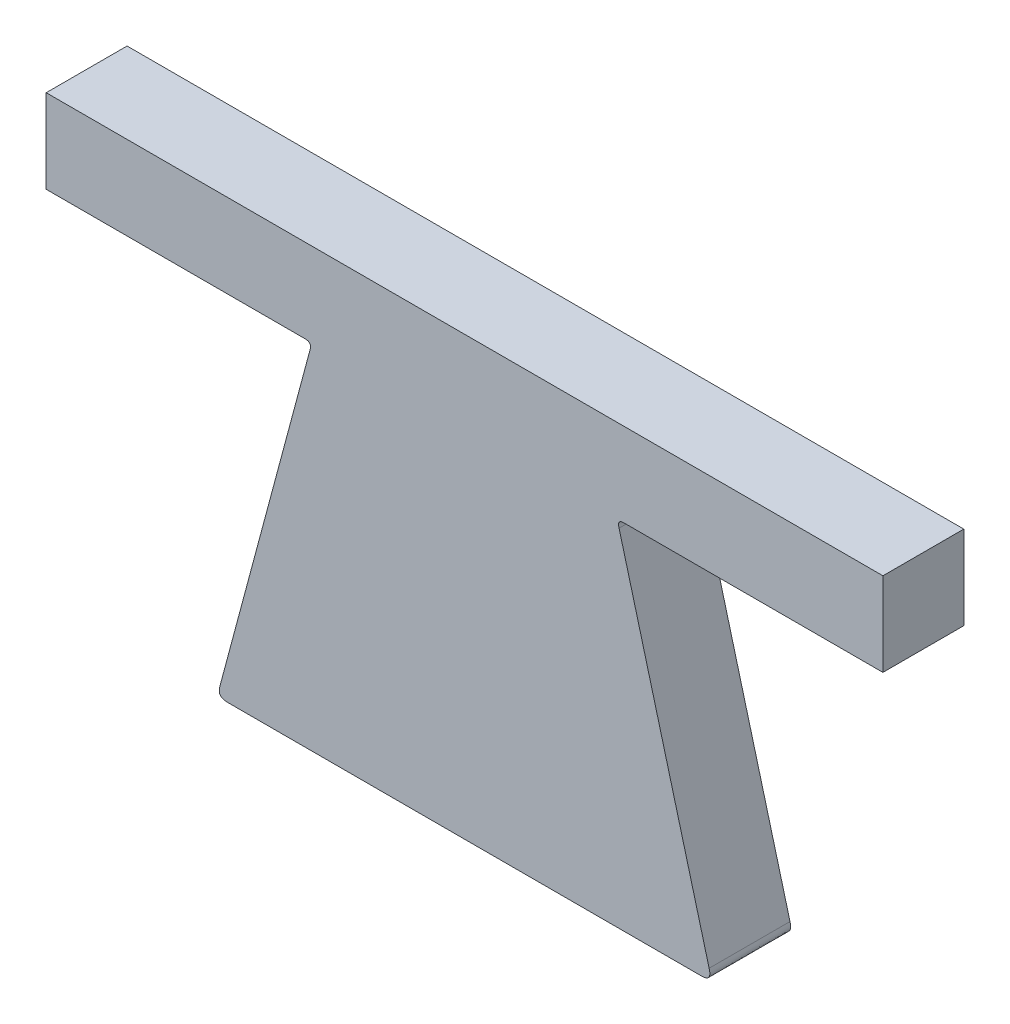
ISO-10303-21;
HEADER;
FILE_DESCRIPTION(('STEP AP214'),'2;1');
FILE_NAME('part.step','',(''),(''),'','','');
FILE_SCHEMA(('AUTOMOTIVE_DESIGN { 1 0 10303 214 1 1 1 1 }'));
ENDSEC;
DATA;
#1=APPLICATION_CONTEXT('core data for automotive mechanical design processes');
#2=APPLICATION_PROTOCOL_DEFINITION('international standard','automotive_design',2000,#1);
#3=PRODUCT_CONTEXT('',#1,'mechanical');
#4=PRODUCT('Part','Part','',(#3));
#5=PRODUCT_RELATED_PRODUCT_CATEGORY('part','',(#4));
#6=PRODUCT_DEFINITION_FORMATION('','',#4);
#7=PRODUCT_DEFINITION_CONTEXT('part definition',#1,'design');
#8=PRODUCT_DEFINITION('design','',#6,#7);
#9=PRODUCT_DEFINITION_SHAPE('','',#8);
#10=(LENGTH_UNIT() NAMED_UNIT(*) SI_UNIT(.MILLI.,.METRE.));
#11=(NAMED_UNIT(*) PLANE_ANGLE_UNIT() SI_UNIT($,.RADIAN.));
#12=(NAMED_UNIT(*) SI_UNIT($,.STERADIAN.) SOLID_ANGLE_UNIT());
#13=UNCERTAINTY_MEASURE_WITH_UNIT(LENGTH_MEASURE(1.E-05),#10,'distance_accuracy_value','');
#14=(GEOMETRIC_REPRESENTATION_CONTEXT(3) GLOBAL_UNCERTAINTY_ASSIGNED_CONTEXT((#13)) GLOBAL_UNIT_ASSIGNED_CONTEXT((#10,
#11,#12)) REPRESENTATION_CONTEXT('',''));
#15=CARTESIAN_POINT('',(0.,0.,0.));
#16=DIRECTION('',(0.,0.,1.));
#17=DIRECTION('',(1.,0.,0.));
#18=AXIS2_PLACEMENT_3D('',#15,#16,#17);
#19=CARTESIAN_POINT('',(-3.,15.78,-36.8505893597143));
#20=DIRECTION('',(0.,-1.,0.));
#21=DIRECTION('',(0.,0.,-1.));
#22=AXIS2_PLACEMENT_3D('',#19,#20,#21);
#23=PLANE('',#22);
#24=DIRECTION('',(-1.,0.,0.));
#25=VECTOR('',#24,1.);
#26=CARTESIAN_POINT('',(-3.,15.78,-2.9));
#27=LINE('',#26,#25);
#28=CARTESIAN_POINT('',(6.26727322274248,15.78,-2.9));
#29=VERTEX_POINT('',#28);
#30=CARTESIAN_POINT('',(-3.,15.78,-2.9));
#31=VERTEX_POINT('',#30);
#32=EDGE_CURVE('E182',#29,#31,#27,.T.);
#33=ORIENTED_EDGE('',*,*,#32,.F.);
#34=CARTESIAN_POINT('',(6.26727322274248,15.78,0.144999999999999));
#35=CARTESIAN_POINT('',(6.26727322274248,15.78,-0.918333333333333));
#36=CARTESIAN_POINT('',(6.26727322274248,15.78,-1.98166666666669));
#37=CARTESIAN_POINT('',(6.26727322274248,15.78,-3.04500000000002));
#38=B_SPLINE_CURVE_WITH_KNOTS('',3,(#34,#35,#36,#37),.UNSPECIFIED.,.F.,.F.,(4,4),
(-0.0369955893597143,-0.0338055893597143),.UNSPECIFIED.);
#39=CARTESIAN_POINT('',(6.26727322274248,15.78,0.));
#40=VERTEX_POINT('',#39);
#41=EDGE_CURVE('E416',#29,#40,#38,.F.);
#42=ORIENTED_EDGE('',*,*,#41,.T.);
#43=DIRECTION('',(1.,0.,0.));
#44=VECTOR('',#43,1.);
#45=CARTESIAN_POINT('',(-3.,15.78,0.));
#46=LINE('',#45,#44);
#47=CARTESIAN_POINT('',(-3.,15.78,0.));
#48=VERTEX_POINT('',#47);
#49=EDGE_CURVE('E393',#48,#40,#46,.T.);
#50=ORIENTED_EDGE('',*,*,#49,.F.);
#51=DIRECTION('',(0.,0.,1.));
#52=VECTOR('',#51,1.);
#53=CARTESIAN_POINT('',(-3.,15.78,-36.8505893597143));
#54=LINE('',#53,#52);
#55=EDGE_CURVE('E170',#31,#48,#54,.T.);
#56=ORIENTED_EDGE('',*,*,#55,.F.);
#57=EDGE_LOOP('',(#33,#42,#50,#56));
#58=FACE_BOUND('',#57,.T.);
#59=ADVANCED_FACE('F46',(#58),#23,.T.);
#60=CARTESIAN_POINT('',(-3.,18.78,-36.8505893597143));
#61=DIRECTION('',(-1.,0.,0.));
#62=DIRECTION('',(0.,0.,1.));
#63=AXIS2_PLACEMENT_3D('',#60,#61,#62);
#64=PLANE('',#63);
#65=DIRECTION('',(0.,1.,0.));
#66=VECTOR('',#65,1.);
#67=CARTESIAN_POINT('',(-3.,18.78,-2.9));
#68=LINE('',#67,#66);
#69=CARTESIAN_POINT('',(-3.,18.78,-2.9));
#70=VERTEX_POINT('',#69);
#71=EDGE_CURVE('E392',#31,#70,#68,.T.);
#72=ORIENTED_EDGE('',*,*,#71,.F.);
#73=ORIENTED_EDGE('',*,*,#55,.T.);
#74=DIRECTION('',(0.,-1.,0.));
#75=VECTOR('',#74,1.);
#76=CARTESIAN_POINT('',(-3.,18.78,0.));
#77=LINE('',#76,#75);
#78=CARTESIAN_POINT('',(-3.,18.78,0.));
#79=VERTEX_POINT('',#78);
#80=EDGE_CURVE('E156',#79,#48,#77,.T.);
#81=ORIENTED_EDGE('',*,*,#80,.F.);
#82=DIRECTION('',(0.,0.,1.));
#83=VECTOR('',#82,1.);
#84=CARTESIAN_POINT('',(-3.,18.78,-36.8505893597143));
#85=LINE('',#84,#83);
#86=EDGE_CURVE('E173',#70,#79,#85,.T.);
#87=ORIENTED_EDGE('',*,*,#86,.F.);
#88=EDGE_LOOP('',(#72,#73,#81,#87));
#89=FACE_BOUND('',#88,.T.);
#90=ADVANCED_FACE('F427',(#89),#64,.T.);
#91=CARTESIAN_POINT('',(-3.,18.78,-36.8505893597143));
#92=DIRECTION('',(0.,1.,0.));
#93=DIRECTION('',(0.,0.,1.));
#94=AXIS2_PLACEMENT_3D('',#91,#92,#93);
#95=PLANE('',#94);
#96=DIRECTION('',(1.,0.,0.));
#97=VECTOR('',#96,1.);
#98=CARTESIAN_POINT('',(-3.,18.78,-2.9));
#99=LINE('',#98,#97);
#100=CARTESIAN_POINT('',(27.,18.78,-2.9));
#101=VERTEX_POINT('',#100);
#102=EDGE_CURVE('E430',#70,#101,#99,.T.);
#103=ORIENTED_EDGE('',*,*,#102,.F.);
#104=ORIENTED_EDGE('',*,*,#86,.T.);
#105=DIRECTION('',(-1.,0.,0.));
#106=VECTOR('',#105,1.);
#107=CARTESIAN_POINT('',(-3.,18.78,0.));
#108=LINE('',#107,#106);
#109=CARTESIAN_POINT('',(27.,18.78,0.));
#110=VERTEX_POINT('',#109);
#111=EDGE_CURVE('E161',#110,#79,#108,.T.);
#112=ORIENTED_EDGE('',*,*,#111,.F.);
#113=DIRECTION('',(0.,0.,1.));
#114=VECTOR('',#113,1.);
#115=CARTESIAN_POINT('',(27.,18.78,-36.8505893597143));
#116=LINE('',#115,#114);
#117=EDGE_CURVE('E155',#101,#110,#116,.T.);
#118=ORIENTED_EDGE('',*,*,#117,.F.);
#119=EDGE_LOOP('',(#103,#104,#112,#118));
#120=FACE_BOUND('',#119,.T.);
#121=ADVANCED_FACE('F434',(#120),#95,.T.);
#122=CARTESIAN_POINT('',(27.,18.78,-36.8505893597143));
#123=DIRECTION('',(1.,0.,0.));
#124=DIRECTION('',(0.,0.,-1.));
#125=AXIS2_PLACEMENT_3D('',#122,#123,#124);
#126=PLANE('',#125);
#127=DIRECTION('',(0.,-1.,0.));
#128=VECTOR('',#127,1.);
#129=CARTESIAN_POINT('',(27.,18.78,-2.9));
#130=LINE('',#129,#128);
#131=CARTESIAN_POINT('',(27.,15.78,-2.9));
#132=VERTEX_POINT('',#131);
#133=EDGE_CURVE('E233',#101,#132,#130,.T.);
#134=ORIENTED_EDGE('',*,*,#133,.F.);
#135=ORIENTED_EDGE('',*,*,#117,.T.);
#136=DIRECTION('',(0.,1.,0.));
#137=VECTOR('',#136,1.);
#138=CARTESIAN_POINT('',(27.,18.78,0.));
#139=LINE('',#138,#137);
#140=CARTESIAN_POINT('',(27.,15.78,0.));
#141=VERTEX_POINT('',#140);
#142=EDGE_CURVE('E146',#141,#110,#139,.T.);
#143=ORIENTED_EDGE('',*,*,#142,.F.);
#144=DIRECTION('',(0.,0.,1.));
#145=VECTOR('',#144,1.);
#146=CARTESIAN_POINT('',(27.,15.78,-36.8505893597143));
#147=LINE('',#146,#145);
#148=EDGE_CURVE('E150',#132,#141,#147,.T.);
#149=ORIENTED_EDGE('',*,*,#148,.F.);
#150=EDGE_LOOP('',(#134,#135,#143,#149));
#151=FACE_BOUND('',#150,.T.);
#152=ADVANCED_FACE('F158',(#151),#126,.T.);
#153=CARTESIAN_POINT('',(17.4720817026893,15.78,-36.8505893597143));
#154=DIRECTION('',(0.,-1.,0.));
#155=DIRECTION('',(0.,0.,-1.));
#156=AXIS2_PLACEMENT_3D('',#153,#154,#155);
#157=PLANE('',#156);
#158=DIRECTION('',(1.,0.,0.));
#159=VECTOR('',#158,1.);
#160=CARTESIAN_POINT('',(17.4720817026893,15.78,0.));
#161=LINE('',#160,#159);
#162=CARTESIAN_POINT('',(17.7327267772575,15.78,0.));
#163=VERTEX_POINT('',#162);
#164=EDGE_CURVE('E140',#163,#141,#161,.T.);
#165=ORIENTED_EDGE('',*,*,#164,.F.);
#166=CARTESIAN_POINT('',(17.7327267772575,15.78,-3.04500000000002));
#167=CARTESIAN_POINT('',(17.7327267772575,15.78,-1.98166666666669));
#168=CARTESIAN_POINT('',(17.7327267772575,15.78,-0.918333333333333));
#169=CARTESIAN_POINT('',(17.7327267772575,15.78,0.144999999999999));
#170=B_SPLINE_CURVE_WITH_KNOTS('',3,(#166,#167,#168,#169),.UNSPECIFIED.,.F.,.F.,(4,4),
(-0.0369955893597143,-0.0338055893597143),.UNSPECIFIED.);
#171=CARTESIAN_POINT('',(17.7327267772575,15.78,-2.9));
#172=VERTEX_POINT('',#171);
#173=EDGE_CURVE('E74',#163,#172,#170,.F.);
#174=ORIENTED_EDGE('',*,*,#173,.T.);
#175=DIRECTION('',(-1.,0.,0.));
#176=VECTOR('',#175,1.);
#177=CARTESIAN_POINT('',(17.4720817026893,15.78,-2.9));
#178=LINE('',#177,#176);
#179=EDGE_CURVE('E152',#132,#172,#178,.T.);
#180=ORIENTED_EDGE('',*,*,#179,.F.);
#181=ORIENTED_EDGE('',*,*,#148,.T.);
#182=EDGE_LOOP('',(#165,#174,#180,#181));
#183=FACE_BOUND('',#182,.T.);
#184=ADVANCED_FACE('F151',(#183),#157,.T.);
#185=CARTESIAN_POINT('',(20.8696774627159,3.1,-36.8505893597143));
#186=DIRECTION('',(0.965925826289069,0.258819045102518,0.));
#187=DIRECTION('',(-0.258819045102518,0.965925826289069,0.));
#188=AXIS2_PLACEMENT_3D('',#185,#186,#187);
#189=PLANE('',#188);
#190=DIRECTION('',(0.258819045102518,-0.965925826289069,0.));
#191=VECTOR('',#190,1.);
#192=CARTESIAN_POINT('',(20.8696774627159,3.1,-2.9));
#193=LINE('',#192,#191);
#194=CARTESIAN_POINT('',(17.5395416119997,15.5282361909795,-2.9));
#195=VERTEX_POINT('',#194);
#196=CARTESIAN_POINT('',(20.7684875987502,3.47764571353075,-2.9));
#197=VERTEX_POINT('',#196);
#198=EDGE_CURVE('E217',#195,#197,#193,.T.);
#199=ORIENTED_EDGE('',*,*,#198,.F.);
#200=CARTESIAN_POINT('',(17.5395416119997,15.5282361909795,0.144999999999999));
#201=CARTESIAN_POINT('',(17.5395416119997,15.5282361909795,-0.918333333333333));
#202=CARTESIAN_POINT('',(17.5395416119997,15.5282361909795,-1.98166666666669));
#203=CARTESIAN_POINT('',(17.5395416119997,15.5282361909795,-3.04500000000002));
#204=B_SPLINE_CURVE_WITH_KNOTS('',3,(#200,#201,#202,#203),.UNSPECIFIED.,.F.,.F.,(4,4),
(-0.0369955893597143,-0.0338055893597143),.UNSPECIFIED.);
#205=CARTESIAN_POINT('',(17.5395416119997,15.5282361909795,0.));
#206=VERTEX_POINT('',#205);
#207=EDGE_CURVE('E549',#195,#206,#204,.F.);
#208=ORIENTED_EDGE('',*,*,#207,.T.);
#209=DIRECTION('',(-0.258819045102518,0.965925826289069,0.));
#210=VECTOR('',#209,1.);
#211=CARTESIAN_POINT('',(20.8696774627159,3.1,0.));
#212=LINE('',#211,#210);
#213=CARTESIAN_POINT('',(20.7684875987502,3.47764571353075,0.));
#214=VERTEX_POINT('',#213);
#215=EDGE_CURVE('E147',#214,#206,#212,.T.);
#216=ORIENTED_EDGE('',*,*,#215,.F.);
#217=CARTESIAN_POINT('',(20.7684875987502,3.47764571353076,-3.045));
#218=CARTESIAN_POINT('',(20.7684875987502,3.47764571353076,-1.98166666666667));
#219=CARTESIAN_POINT('',(20.7684875987502,3.47764571353076,-0.918333333333313));
#220=CARTESIAN_POINT('',(20.7684875987502,3.47764571353076,0.14500000000002));
#221=B_SPLINE_CURVE_WITH_KNOTS('',3,(#217,#218,#219,#220),.UNSPECIFIED.,.F.,.F.,(4,4),
(0.0338055893597143,0.0369955893597143),.UNSPECIFIED.);
#222=EDGE_CURVE('E381',#214,#197,#221,.F.);
#223=ORIENTED_EDGE('',*,*,#222,.T.);
#224=EDGE_LOOP('',(#199,#208,#216,#223));
#225=FACE_BOUND('',#224,.T.);
#226=ADVANCED_FACE('F252',(#225),#189,.T.);
#227=CARTESIAN_POINT('',(3.13032253728412,3.1,-36.8505893597143));
#228=DIRECTION('',(0.,-1.,0.));
#229=DIRECTION('',(0.,0.,-1.));
#230=AXIS2_PLACEMENT_3D('',#227,#228,#229);
#231=PLANE('',#230);
#232=DIRECTION('',(1.,0.,0.));
#233=VECTOR('',#232,1.);
#234=CARTESIAN_POINT('',(3.13032253728412,3.1,0.));
#235=LINE('',#234,#233);
#236=CARTESIAN_POINT('',(3.52129014913648,3.1,0.));
#237=VERTEX_POINT('',#236);
#238=CARTESIAN_POINT('',(20.4787098508635,3.1,0.));
#239=VERTEX_POINT('',#238);
#240=EDGE_CURVE('E193',#237,#239,#235,.T.);
#241=ORIENTED_EDGE('',*,*,#240,.F.);
#242=CARTESIAN_POINT('',(3.52129014913648,3.1,-3.045));
#243=CARTESIAN_POINT('',(3.52129014913648,3.1,-1.98166666666667));
#244=CARTESIAN_POINT('',(3.52129014913648,3.1,-0.918333333333313));
#245=CARTESIAN_POINT('',(3.52129014913648,3.1,0.14500000000002));
#246=B_SPLINE_CURVE_WITH_KNOTS('',3,(#242,#243,#244,#245),.UNSPECIFIED.,.F.,.F.,(4,4),
(0.0338055893597143,0.0369955893597143),.UNSPECIFIED.);
#247=CARTESIAN_POINT('',(3.52129014913648,3.1,-2.9));
#248=VERTEX_POINT('',#247);
#249=EDGE_CURVE('E538',#237,#248,#246,.F.);
#250=ORIENTED_EDGE('',*,*,#249,.T.);
#251=DIRECTION('',(-1.,0.,0.));
#252=VECTOR('',#251,1.);
#253=CARTESIAN_POINT('',(3.13032253728412,3.1,-2.9));
#254=LINE('',#253,#252);
#255=CARTESIAN_POINT('',(20.4787098508635,3.1,-2.9));
#256=VERTEX_POINT('',#255);
#257=EDGE_CURVE('E172',#256,#248,#254,.T.);
#258=ORIENTED_EDGE('',*,*,#257,.F.);
#259=CARTESIAN_POINT('',(20.4787098508635,3.1,0.14500000000002));
#260=CARTESIAN_POINT('',(20.4787098508635,3.1,-0.918333333333313));
#261=CARTESIAN_POINT('',(20.4787098508635,3.1,-1.98166666666667));
#262=CARTESIAN_POINT('',(20.4787098508635,3.1,-3.045));
#263=B_SPLINE_CURVE_WITH_KNOTS('',3,(#259,#260,#261,#262),.UNSPECIFIED.,.F.,.F.,(4,4),
(0.0338055893597143,0.0369955893597143),.UNSPECIFIED.);
#264=EDGE_CURVE('E361',#256,#239,#263,.F.);
#265=ORIENTED_EDGE('',*,*,#264,.T.);
#266=EDGE_LOOP('',(#241,#250,#258,#265));
#267=FACE_BOUND('',#266,.T.);
#268=ADVANCED_FACE('F206',(#267),#231,.T.);
#269=CARTESIAN_POINT('',(6.52791829731072,15.78,-36.8505893597143));
#270=DIRECTION('',(-0.965925826289069,0.258819045102518,0.));
#271=DIRECTION('',(-0.258819045102518,-0.965925826289069,0.));
#272=AXIS2_PLACEMENT_3D('',#269,#270,#271);
#273=PLANE('',#272);
#274=DIRECTION('',(-0.258819045102518,-0.965925826289069,0.));
#275=VECTOR('',#274,1.);
#276=CARTESIAN_POINT('',(6.52791829731072,15.78,0.));
#277=LINE('',#276,#275);
#278=CARTESIAN_POINT('',(6.46045838800029,15.5282361909795,0.));
#279=VERTEX_POINT('',#278);
#280=CARTESIAN_POINT('',(3.23151240124976,3.47764571353075,0.));
#281=VERTEX_POINT('',#280);
#282=EDGE_CURVE('E402',#279,#281,#277,.T.);
#283=ORIENTED_EDGE('',*,*,#282,.F.);
#284=CARTESIAN_POINT('',(6.46045838800029,15.5282361909795,-3.04500000000002));
#285=CARTESIAN_POINT('',(6.46045838800029,15.5282361909795,-1.98166666666669));
#286=CARTESIAN_POINT('',(6.46045838800029,15.5282361909795,-0.918333333333333));
#287=CARTESIAN_POINT('',(6.46045838800029,15.5282361909795,0.144999999999999));
#288=B_SPLINE_CURVE_WITH_KNOTS('',3,(#284,#285,#286,#287),.UNSPECIFIED.,.F.,.F.,(4,4),
(-0.0369955893597143,-0.0338055893597143),.UNSPECIFIED.);
#289=CARTESIAN_POINT('',(6.46045838800029,15.5282361909795,-2.9));
#290=VERTEX_POINT('',#289);
#291=EDGE_CURVE('E421',#279,#290,#288,.F.);
#292=ORIENTED_EDGE('',*,*,#291,.T.);
#293=DIRECTION('',(0.258819045102518,0.965925826289069,0.));
#294=VECTOR('',#293,1.);
#295=CARTESIAN_POINT('',(6.52791829731072,15.78,-2.9));
#296=LINE('',#295,#294);
#297=CARTESIAN_POINT('',(3.23151240124976,3.47764571353075,-2.9));
#298=VERTEX_POINT('',#297);
#299=EDGE_CURVE('E178',#298,#290,#296,.T.);
#300=ORIENTED_EDGE('',*,*,#299,.F.);
#301=CARTESIAN_POINT('',(3.23151240124976,3.47764571353076,0.14500000000002));
#302=CARTESIAN_POINT('',(3.23151240124976,3.47764571353076,-0.918333333333313));
#303=CARTESIAN_POINT('',(3.23151240124976,3.47764571353076,-1.98166666666667));
#304=CARTESIAN_POINT('',(3.23151240124976,3.47764571353076,-3.045));
#305=B_SPLINE_CURVE_WITH_KNOTS('',3,(#301,#302,#303,#304),.UNSPECIFIED.,.F.,.F.,(4,4),
(0.0338055893597143,0.0369955893597143),.UNSPECIFIED.);
#306=EDGE_CURVE('E181',#298,#281,#305,.F.);
#307=ORIENTED_EDGE('',*,*,#306,.T.);
#308=EDGE_LOOP('',(#283,#292,#300,#307));
#309=FACE_BOUND('',#308,.T.);
#310=ADVANCED_FACE('F196',(#309),#273,.T.);
#311=CARTESIAN_POINT('',(0.,0.,0.));
#312=DIRECTION('',(0.,0.,-1.));
#313=DIRECTION('',(-1.,0.,0.));
#314=AXIS2_PLACEMENT_3D('',#311,#312,#313);
#315=PLANE('',#314);
#316=ORIENTED_EDGE('',*,*,#49,.T.);
#317=CARTESIAN_POINT('',(6.46045838800029,15.5282361909795,0.));
#318=CARTESIAN_POINT('',(6.47126147547037,15.5685538622964,0.));
#319=CARTESIAN_POINT('',(6.48206456294044,15.6088715336134,0.));
#320=CARTESIAN_POINT('',(6.48499896581412,15.7017522858017,0.));
#321=CARTESIAN_POINT('',(6.44122846892415,15.7587951079306,0.));
#322=CARTESIAN_POINT('',(6.35075307227053,15.78,0.));
#323=CARTESIAN_POINT('',(6.30901314750651,15.78,0.));
#324=CARTESIAN_POINT('',(6.26727322274248,15.78,0.));
#325=B_SPLINE_CURVE_WITH_KNOTS('',5,(#317,#318,#319,#320,#321,#322,#323,#324),.UNSPECIFIED.,.F.,
.F.,(6,2,6),(0.,0.5,1.),.UNSPECIFIED.);
#326=EDGE_CURVE('E422',#40,#279,#325,.F.);
#327=ORIENTED_EDGE('',*,*,#326,.T.);
#328=ORIENTED_EDGE('',*,*,#282,.T.);
#329=CARTESIAN_POINT('',(3.52129014913648,3.1,0.));
#330=CARTESIAN_POINT('',(3.45868026199044,3.1,0.));
#331=CARTESIAN_POINT('',(3.3960703748444,3.1,0.));
#332=CARTESIAN_POINT('',(3.26035727986398,3.13180733810407,0.));
#333=CARTESIAN_POINT('',(3.19470153452902,3.21737157129738,0.));
#334=CARTESIAN_POINT('',(3.19910313883953,3.35669269957995,0.));
#335=CARTESIAN_POINT('',(3.21530777004465,3.41716920655535,0.));
#336=CARTESIAN_POINT('',(3.23151240124976,3.47764571353076,0.));
#337=B_SPLINE_CURVE_WITH_KNOTS('',5,(#329,#330,#331,#332,#333,#334,#335,#336),.UNSPECIFIED.,.F.,
.F.,(6,2,6),(0.,0.5,1.),.UNSPECIFIED.);
#338=EDGE_CURVE('E274',#281,#237,#337,.F.);
#339=ORIENTED_EDGE('',*,*,#338,.T.);
#340=ORIENTED_EDGE('',*,*,#240,.T.);
#341=CARTESIAN_POINT('',(20.7684875987502,3.47764571353076,0.));
#342=CARTESIAN_POINT('',(20.7846922299554,3.41716920655535,0.));
#343=CARTESIAN_POINT('',(20.8008968611605,3.35669269957995,0.));
#344=CARTESIAN_POINT('',(20.805298465471,3.21737157129738,0.));
#345=CARTESIAN_POINT('',(20.739642720136,3.13180733810407,0.));
#346=CARTESIAN_POINT('',(20.6039296251556,3.1,0.));
#347=CARTESIAN_POINT('',(20.5413197380096,3.1,0.));
#348=CARTESIAN_POINT('',(20.4787098508635,3.1,0.));
#349=B_SPLINE_CURVE_WITH_KNOTS('',5,(#341,#342,#343,#344,#345,#346,#347,#348),.UNSPECIFIED.,.F.,
.F.,(6,2,6),(0.,0.5,1.),.UNSPECIFIED.);
#350=EDGE_CURVE('E349',#239,#214,#349,.F.);
#351=ORIENTED_EDGE('',*,*,#350,.T.);
#352=ORIENTED_EDGE('',*,*,#215,.T.);
#353=CARTESIAN_POINT('',(17.7327267772575,15.78,0.));
#354=CARTESIAN_POINT('',(17.6909868524935,15.78,0.));
#355=CARTESIAN_POINT('',(17.6492469277295,15.78,0.));
#356=CARTESIAN_POINT('',(17.5587715310758,15.7587951079306,0.));
#357=CARTESIAN_POINT('',(17.5150010341859,15.7017522858017,0.));
#358=CARTESIAN_POINT('',(17.5179354370595,15.6088715336134,0.));
#359=CARTESIAN_POINT('',(17.5287385245296,15.5685538622964,0.));
#360=CARTESIAN_POINT('',(17.5395416119997,15.5282361909795,0.));
#361=B_SPLINE_CURVE_WITH_KNOTS('',5,(#353,#354,#355,#356,#357,#358,#359,#360),.UNSPECIFIED.,.F.,
.F.,(6,2,6),(0.,0.5,1.),.UNSPECIFIED.);
#362=EDGE_CURVE('E60',#206,#163,#361,.F.);
#363=ORIENTED_EDGE('',*,*,#362,.T.);
#364=ORIENTED_EDGE('',*,*,#164,.T.);
#365=ORIENTED_EDGE('',*,*,#142,.T.);
#366=ORIENTED_EDGE('',*,*,#111,.T.);
#367=ORIENTED_EDGE('',*,*,#80,.T.);
#368=EDGE_LOOP('',(#316,#327,#328,#339,#340,#351,#352,#363,#364,#365,#366,#367));
#369=FACE_BOUND('',#368,.T.);
#370=ADVANCED_FACE('F143',(#369),#315,.F.);
#371=CARTESIAN_POINT('',(0.,0.,-2.9));
#372=DIRECTION('',(0.,0.,1.));
#373=DIRECTION('',(0.,-1.,0.));
#374=AXIS2_PLACEMENT_3D('',#371,#372,#373);
#375=PLANE('',#374);
#376=ORIENTED_EDGE('',*,*,#257,.T.);
#377=CARTESIAN_POINT('',(3.23151240124976,3.47764571353076,-2.9));
#378=CARTESIAN_POINT('',(3.21530777004465,3.41716920655535,-2.9));
#379=CARTESIAN_POINT('',(3.19910313883953,3.35669269957995,-2.9));
#380=CARTESIAN_POINT('',(3.19470153452902,3.21737157129738,-2.9));
#381=CARTESIAN_POINT('',(3.26035727986398,3.13180733810407,-2.9));
#382=CARTESIAN_POINT('',(3.3960703748444,3.1,-2.9));
#383=CARTESIAN_POINT('',(3.45868026199044,3.1,-2.9));
#384=CARTESIAN_POINT('',(3.52129014913648,3.1,-2.9));
#385=B_SPLINE_CURVE_WITH_KNOTS('',5,(#377,#378,#379,#380,#381,#382,#383,#384),.UNSPECIFIED.,.F.,
.F.,(6,2,6),(0.,0.5,1.),.UNSPECIFIED.);
#386=EDGE_CURVE('E542',#248,#298,#385,.F.);
#387=ORIENTED_EDGE('',*,*,#386,.T.);
#388=ORIENTED_EDGE('',*,*,#299,.T.);
#389=CARTESIAN_POINT('',(6.26727322274248,15.78,-2.9));
#390=CARTESIAN_POINT('',(6.30901314750651,15.78,-2.9));
#391=CARTESIAN_POINT('',(6.35075307227053,15.78,-2.9));
#392=CARTESIAN_POINT('',(6.44122846892415,15.7587951079306,-2.9));
#393=CARTESIAN_POINT('',(6.48499896581412,15.7017522858017,-2.9));
#394=CARTESIAN_POINT('',(6.48206456294045,15.6088715336134,-2.9));
#395=CARTESIAN_POINT('',(6.47126147547037,15.5685538622964,-2.9));
#396=CARTESIAN_POINT('',(6.46045838800029,15.5282361909795,-2.9));
#397=B_SPLINE_CURVE_WITH_KNOTS('',5,(#389,#390,#391,#392,#393,#394,#395,#396),.UNSPECIFIED.,.F.,
.F.,(6,2,6),(0.,0.5,1.),.UNSPECIFIED.);
#398=EDGE_CURVE('E554',#290,#29,#397,.F.);
#399=ORIENTED_EDGE('',*,*,#398,.T.);
#400=ORIENTED_EDGE('',*,*,#32,.T.);
#401=ORIENTED_EDGE('',*,*,#71,.T.);
#402=ORIENTED_EDGE('',*,*,#102,.T.);
#403=ORIENTED_EDGE('',*,*,#133,.T.);
#404=ORIENTED_EDGE('',*,*,#179,.T.);
#405=CARTESIAN_POINT('',(17.5395416119997,15.5282361909795,-2.9));
#406=CARTESIAN_POINT('',(17.5287385245296,15.5685538622964,-2.9));
#407=CARTESIAN_POINT('',(17.5179354370596,15.6088715336134,-2.9));
#408=CARTESIAN_POINT('',(17.5150010341859,15.7017522858017,-2.9));
#409=CARTESIAN_POINT('',(17.5587715310758,15.7587951079306,-2.9));
#410=CARTESIAN_POINT('',(17.6492469277295,15.78,-2.9));
#411=CARTESIAN_POINT('',(17.6909868524935,15.78,-2.9));
#412=CARTESIAN_POINT('',(17.7327267772575,15.78,-2.9));
#413=B_SPLINE_CURVE_WITH_KNOTS('',5,(#405,#406,#407,#408,#409,#410,#411,#412),.UNSPECIFIED.,.F.,
.F.,(6,2,6),(0.,0.5,1.),.UNSPECIFIED.);
#414=EDGE_CURVE('E13',#172,#195,#413,.F.);
#415=ORIENTED_EDGE('',*,*,#414,.T.);
#416=ORIENTED_EDGE('',*,*,#198,.T.);
#417=CARTESIAN_POINT('',(20.4787098508635,3.1,-2.9));
#418=CARTESIAN_POINT('',(20.5413197380096,3.1,-2.9));
#419=CARTESIAN_POINT('',(20.6039296251556,3.1,-2.9));
#420=CARTESIAN_POINT('',(20.739642720136,3.13180733810407,-2.9));
#421=CARTESIAN_POINT('',(20.805298465471,3.21737157129738,-2.9));
#422=CARTESIAN_POINT('',(20.8008968611605,3.35669269957995,-2.9));
#423=CARTESIAN_POINT('',(20.7846922299554,3.41716920655535,-2.9));
#424=CARTESIAN_POINT('',(20.7684875987502,3.47764571353075,-2.9));
#425=B_SPLINE_CURVE_WITH_KNOTS('',5,(#417,#418,#419,#420,#421,#422,#423,#424),.UNSPECIFIED.,.F.,
.F.,(6,2,6),(0.,0.5,1.),.UNSPECIFIED.);
#426=EDGE_CURVE('E371',#197,#256,#425,.F.);
#427=ORIENTED_EDGE('',*,*,#426,.T.);
#428=EDGE_LOOP('',(#376,#387,#388,#399,#400,#401,#402,#403,#404,#415,#416,#427));
#429=FACE_BOUND('',#428,.T.);
#430=ADVANCED_FACE('F295',(#429),#375,.F.);
#431=CARTESIAN_POINT('',(3.23151240124976,3.47764571353076,-3.045));
#432=CARTESIAN_POINT('',(3.23151240124976,3.47764571353076,-1.98166666666667));
#433=CARTESIAN_POINT('',(3.23151240124976,3.47764571353076,-0.918333333333313));
#434=CARTESIAN_POINT('',(3.23151240124976,3.47764571353076,0.14500000000002));
#435=CARTESIAN_POINT('',(3.21530777004465,3.41716920655535,-3.045));
#436=CARTESIAN_POINT('',(3.21530777004465,3.41716920655535,-1.98166666666667));
#437=CARTESIAN_POINT('',(3.21530777004465,3.41716920655535,-0.918333333333313));
#438=CARTESIAN_POINT('',(3.21530777004465,3.41716920655535,0.14500000000002));
#439=CARTESIAN_POINT('',(3.19910313883953,3.35669269957995,-3.045));
#440=CARTESIAN_POINT('',(3.19910313883953,3.35669269957995,-1.98166666666667));
#441=CARTESIAN_POINT('',(3.19910313883953,3.35669269957995,-0.918333333333313));
#442=CARTESIAN_POINT('',(3.19910313883953,3.35669269957995,0.14500000000002));
#443=CARTESIAN_POINT('',(3.19470153452902,3.21737157129738,-3.045));
#444=CARTESIAN_POINT('',(3.19470153452902,3.21737157129738,-1.98166666666667));
#445=CARTESIAN_POINT('',(3.19470153452902,3.21737157129738,-0.918333333333313));
#446=CARTESIAN_POINT('',(3.19470153452902,3.21737157129738,0.14500000000002));
#447=CARTESIAN_POINT('',(3.26035727986398,3.13180733810407,-3.045));
#448=CARTESIAN_POINT('',(3.26035727986398,3.13180733810407,-1.98166666666667));
#449=CARTESIAN_POINT('',(3.26035727986398,3.13180733810407,-0.918333333333313));
#450=CARTESIAN_POINT('',(3.26035727986398,3.13180733810407,0.14500000000002));
#451=CARTESIAN_POINT('',(3.3960703748444,3.1,-3.045));
#452=CARTESIAN_POINT('',(3.3960703748444,3.1,-1.98166666666667));
#453=CARTESIAN_POINT('',(3.3960703748444,3.1,-0.918333333333313));
#454=CARTESIAN_POINT('',(3.3960703748444,3.1,0.14500000000002));
#455=CARTESIAN_POINT('',(3.45868026199044,3.1,-3.045));
#456=CARTESIAN_POINT('',(3.45868026199044,3.1,-1.98166666666667));
#457=CARTESIAN_POINT('',(3.45868026199044,3.1,-0.918333333333313));
#458=CARTESIAN_POINT('',(3.45868026199044,3.1,0.14500000000002));
#459=CARTESIAN_POINT('',(3.52129014913648,3.1,-3.045));
#460=CARTESIAN_POINT('',(3.52129014913648,3.1,-1.98166666666667));
#461=CARTESIAN_POINT('',(3.52129014913648,3.1,-0.918333333333313));
#462=CARTESIAN_POINT('',(3.52129014913648,3.1,0.14500000000002));
#463=B_SPLINE_SURFACE_WITH_KNOTS('',5,3,((#431,#432,#433,#434),(#435,#436,#437,#438),(#439,#440,
#441,#442),(#443,#444,#445,#446),(#447,#448,#449,#450),(#451,#452,#453,#454),(#455,#456,#457,
#458),(#459,#460,#461,#462)),.UNSPECIFIED.,.F.,.F.,.F.,(6,2,6),(4,4),(0.,0.5,1.),
(0.0338055893597143,0.0369955893597143),.UNSPECIFIED.);
#464=ORIENTED_EDGE('',*,*,#386,.F.);
#465=ORIENTED_EDGE('',*,*,#249,.F.);
#466=ORIENTED_EDGE('',*,*,#338,.F.);
#467=ORIENTED_EDGE('',*,*,#306,.F.);
#468=EDGE_LOOP('',(#464,#465,#466,#467));
#469=FACE_BOUND('',#468,.T.);
#470=ADVANCED_FACE('F280',(#469),#463,.T.);
#471=CARTESIAN_POINT('',(20.4787098508635,3.1,-3.045));
#472=CARTESIAN_POINT('',(20.4787098508635,3.1,-1.98166666666667));
#473=CARTESIAN_POINT('',(20.4787098508635,3.1,-0.918333333333313));
#474=CARTESIAN_POINT('',(20.4787098508635,3.1,0.14500000000002));
#475=CARTESIAN_POINT('',(20.5413197380096,3.1,-3.045));
#476=CARTESIAN_POINT('',(20.5413197380096,3.1,-1.98166666666667));
#477=CARTESIAN_POINT('',(20.5413197380096,3.1,-0.918333333333313));
#478=CARTESIAN_POINT('',(20.5413197380096,3.1,0.14500000000002));
#479=CARTESIAN_POINT('',(20.6039296251556,3.1,-3.045));
#480=CARTESIAN_POINT('',(20.6039296251556,3.1,-1.98166666666667));
#481=CARTESIAN_POINT('',(20.6039296251556,3.1,-0.918333333333313));
#482=CARTESIAN_POINT('',(20.6039296251556,3.1,0.14500000000002));
#483=CARTESIAN_POINT('',(20.739642720136,3.13180733810407,-3.045));
#484=CARTESIAN_POINT('',(20.739642720136,3.13180733810407,-1.98166666666667));
#485=CARTESIAN_POINT('',(20.739642720136,3.13180733810407,-0.918333333333313));
#486=CARTESIAN_POINT('',(20.739642720136,3.13180733810407,0.14500000000002));
#487=CARTESIAN_POINT('',(20.805298465471,3.21737157129738,-3.045));
#488=CARTESIAN_POINT('',(20.805298465471,3.21737157129738,-1.98166666666667));
#489=CARTESIAN_POINT('',(20.805298465471,3.21737157129738,-0.918333333333313));
#490=CARTESIAN_POINT('',(20.805298465471,3.21737157129738,0.14500000000002));
#491=CARTESIAN_POINT('',(20.8008968611605,3.35669269957995,-3.045));
#492=CARTESIAN_POINT('',(20.8008968611605,3.35669269957995,-1.98166666666667));
#493=CARTESIAN_POINT('',(20.8008968611605,3.35669269957995,-0.918333333333313));
#494=CARTESIAN_POINT('',(20.8008968611605,3.35669269957995,0.14500000000002));
#495=CARTESIAN_POINT('',(20.7846922299554,3.41716920655535,-3.045));
#496=CARTESIAN_POINT('',(20.7846922299554,3.41716920655535,-1.98166666666667));
#497=CARTESIAN_POINT('',(20.7846922299554,3.41716920655535,-0.918333333333313));
#498=CARTESIAN_POINT('',(20.7846922299554,3.41716920655535,0.14500000000002));
#499=CARTESIAN_POINT('',(20.7684875987502,3.47764571353076,-3.045));
#500=CARTESIAN_POINT('',(20.7684875987502,3.47764571353076,-1.98166666666667));
#501=CARTESIAN_POINT('',(20.7684875987502,3.47764571353076,-0.918333333333313));
#502=CARTESIAN_POINT('',(20.7684875987502,3.47764571353076,0.14500000000002));
#503=B_SPLINE_SURFACE_WITH_KNOTS('',5,3,((#471,#472,#473,#474),(#475,#476,#477,#478),(#479,#480,
#481,#482),(#483,#484,#485,#486),(#487,#488,#489,#490),(#491,#492,#493,#494),(#495,#496,#497,
#498),(#499,#500,#501,#502)),.UNSPECIFIED.,.F.,.F.,.F.,(6,2,6),(4,4),(0.,0.5,1.),
(0.0338055893597143,0.0369955893597143),.UNSPECIFIED.);
#504=ORIENTED_EDGE('',*,*,#426,.F.);
#505=ORIENTED_EDGE('',*,*,#222,.F.);
#506=ORIENTED_EDGE('',*,*,#350,.F.);
#507=ORIENTED_EDGE('',*,*,#264,.F.);
#508=EDGE_LOOP('',(#504,#505,#506,#507));
#509=FACE_BOUND('',#508,.T.);
#510=ADVANCED_FACE('F294',(#509),#503,.T.);
#511=CARTESIAN_POINT('',(6.46045838800029,15.5282361909795,0.144999999999999));
#512=CARTESIAN_POINT('',(6.46045838800029,15.5282361909795,-0.918333333333333));
#513=CARTESIAN_POINT('',(6.46045838800029,15.5282361909795,-1.98166666666669));
#514=CARTESIAN_POINT('',(6.46045838800029,15.5282361909795,-3.04500000000002));
#515=CARTESIAN_POINT('',(6.47126147547037,15.5685538622964,0.144999999999999));
#516=CARTESIAN_POINT('',(6.47126147547037,15.5685538622964,-0.918333333333333));
#517=CARTESIAN_POINT('',(6.47126147547037,15.5685538622964,-1.98166666666669));
#518=CARTESIAN_POINT('',(6.47126147547037,15.5685538622964,-3.04500000000002));
#519=CARTESIAN_POINT('',(6.48206456294045,15.6088715336134,0.144999999999999));
#520=CARTESIAN_POINT('',(6.48206456294045,15.6088715336134,-0.918333333333333));
#521=CARTESIAN_POINT('',(6.48206456294045,15.6088715336134,-1.98166666666669));
#522=CARTESIAN_POINT('',(6.48206456294045,15.6088715336134,-3.04500000000002));
#523=CARTESIAN_POINT('',(6.48499896581412,15.7017522858017,0.144999999999999));
#524=CARTESIAN_POINT('',(6.48499896581412,15.7017522858017,-0.918333333333333));
#525=CARTESIAN_POINT('',(6.48499896581412,15.7017522858017,-1.98166666666669));
#526=CARTESIAN_POINT('',(6.48499896581412,15.7017522858017,-3.04500000000002));
#527=CARTESIAN_POINT('',(6.44122846892415,15.7587951079306,0.144999999999999));
#528=CARTESIAN_POINT('',(6.44122846892415,15.7587951079306,-0.918333333333333));
#529=CARTESIAN_POINT('',(6.44122846892415,15.7587951079306,-1.98166666666669));
#530=CARTESIAN_POINT('',(6.44122846892415,15.7587951079306,-3.04500000000002));
#531=CARTESIAN_POINT('',(6.35075307227053,15.78,0.144999999999999));
#532=CARTESIAN_POINT('',(6.35075307227053,15.78,-0.918333333333333));
#533=CARTESIAN_POINT('',(6.35075307227053,15.78,-1.98166666666669));
#534=CARTESIAN_POINT('',(6.35075307227053,15.78,-3.04500000000002));
#535=CARTESIAN_POINT('',(6.30901314750651,15.78,0.144999999999999));
#536=CARTESIAN_POINT('',(6.30901314750651,15.78,-0.918333333333333));
#537=CARTESIAN_POINT('',(6.30901314750651,15.78,-1.98166666666669));
#538=CARTESIAN_POINT('',(6.30901314750651,15.78,-3.04500000000002));
#539=CARTESIAN_POINT('',(6.26727322274248,15.78,0.144999999999999));
#540=CARTESIAN_POINT('',(6.26727322274248,15.78,-0.918333333333333));
#541=CARTESIAN_POINT('',(6.26727322274248,15.78,-1.98166666666669));
#542=CARTESIAN_POINT('',(6.26727322274248,15.78,-3.04500000000002));
#543=B_SPLINE_SURFACE_WITH_KNOTS('',5,3,((#511,#512,#513,#514),(#515,#516,#517,#518),(#519,#520,
#521,#522),(#523,#524,#525,#526),(#527,#528,#529,#530),(#531,#532,#533,#534),(#535,#536,#537,
#538),(#539,#540,#541,#542)),.UNSPECIFIED.,.F.,.F.,.F.,(6,2,6),(4,4),(0.,0.5,1.),
(-0.0369955893597143,-0.0338055893597143),.UNSPECIFIED.);
#544=ORIENTED_EDGE('',*,*,#398,.F.);
#545=ORIENTED_EDGE('',*,*,#291,.F.);
#546=ORIENTED_EDGE('',*,*,#326,.F.);
#547=ORIENTED_EDGE('',*,*,#41,.F.);
#548=EDGE_LOOP('',(#544,#545,#546,#547));
#549=FACE_BOUND('',#548,.T.);
#550=ADVANCED_FACE('F484',(#549),#543,.T.);
#551=CARTESIAN_POINT('',(17.7327267772575,15.78,0.144999999999999));
#552=CARTESIAN_POINT('',(17.7327267772575,15.78,-0.918333333333333));
#553=CARTESIAN_POINT('',(17.7327267772575,15.78,-1.98166666666669));
#554=CARTESIAN_POINT('',(17.7327267772575,15.78,-3.04500000000002));
#555=CARTESIAN_POINT('',(17.6909868524935,15.78,0.144999999999999));
#556=CARTESIAN_POINT('',(17.6909868524935,15.78,-0.918333333333333));
#557=CARTESIAN_POINT('',(17.6909868524935,15.78,-1.98166666666669));
#558=CARTESIAN_POINT('',(17.6909868524935,15.78,-3.04500000000002));
#559=CARTESIAN_POINT('',(17.6492469277295,15.78,0.144999999999999));
#560=CARTESIAN_POINT('',(17.6492469277295,15.78,-0.918333333333333));
#561=CARTESIAN_POINT('',(17.6492469277295,15.78,-1.98166666666669));
#562=CARTESIAN_POINT('',(17.6492469277295,15.78,-3.04500000000002));
#563=CARTESIAN_POINT('',(17.5587715310758,15.7587951079306,0.144999999999999));
#564=CARTESIAN_POINT('',(17.5587715310758,15.7587951079306,-0.918333333333333));
#565=CARTESIAN_POINT('',(17.5587715310758,15.7587951079306,-1.98166666666669));
#566=CARTESIAN_POINT('',(17.5587715310758,15.7587951079306,-3.04500000000002));
#567=CARTESIAN_POINT('',(17.5150010341859,15.7017522858017,0.144999999999999));
#568=CARTESIAN_POINT('',(17.5150010341859,15.7017522858017,-0.918333333333333));
#569=CARTESIAN_POINT('',(17.5150010341859,15.7017522858017,-1.98166666666669));
#570=CARTESIAN_POINT('',(17.5150010341859,15.7017522858017,-3.04500000000002));
#571=CARTESIAN_POINT('',(17.5179354370596,15.6088715336134,0.144999999999999));
#572=CARTESIAN_POINT('',(17.5179354370596,15.6088715336134,-0.918333333333333));
#573=CARTESIAN_POINT('',(17.5179354370596,15.6088715336134,-1.98166666666669));
#574=CARTESIAN_POINT('',(17.5179354370596,15.6088715336134,-3.04500000000002));
#575=CARTESIAN_POINT('',(17.5287385245296,15.5685538622964,0.144999999999999));
#576=CARTESIAN_POINT('',(17.5287385245296,15.5685538622964,-0.918333333333333));
#577=CARTESIAN_POINT('',(17.5287385245296,15.5685538622964,-1.98166666666669));
#578=CARTESIAN_POINT('',(17.5287385245296,15.5685538622964,-3.04500000000002));
#579=CARTESIAN_POINT('',(17.5395416119997,15.5282361909795,0.144999999999999));
#580=CARTESIAN_POINT('',(17.5395416119997,15.5282361909795,-0.918333333333333));
#581=CARTESIAN_POINT('',(17.5395416119997,15.5282361909795,-1.98166666666669));
#582=CARTESIAN_POINT('',(17.5395416119997,15.5282361909795,-3.04500000000002));
#583=B_SPLINE_SURFACE_WITH_KNOTS('',5,3,((#551,#552,#553,#554),(#555,#556,#557,#558),(#559,#560,
#561,#562),(#563,#564,#565,#566),(#567,#568,#569,#570),(#571,#572,#573,#574),(#575,#576,#577,
#578),(#579,#580,#581,#582)),.UNSPECIFIED.,.F.,.F.,.F.,(6,2,6),(4,4),(0.,0.5,1.),
(-0.0369955893597143,-0.0338055893597143),.UNSPECIFIED.);
#584=ORIENTED_EDGE('',*,*,#414,.F.);
#585=ORIENTED_EDGE('',*,*,#173,.F.);
#586=ORIENTED_EDGE('',*,*,#362,.F.);
#587=ORIENTED_EDGE('',*,*,#207,.F.);
#588=EDGE_LOOP('',(#584,#585,#586,#587));
#589=FACE_BOUND('',#588,.T.);
#590=ADVANCED_FACE('F49',(#589),#583,.T.);
#591=CLOSED_SHELL('',(#59,#90,#121,#152,#184,#226,#268,#310,#370,#430,#470,#510,#550,#590));
#592=MANIFOLD_SOLID_BREP('B2',#591);
#593=ADVANCED_BREP_SHAPE_REPRESENTATION('',(#18,#592),#14);
#594=SHAPE_DEFINITION_REPRESENTATION(#9,#593);
ENDSEC;
END-ISO-10303-21;
